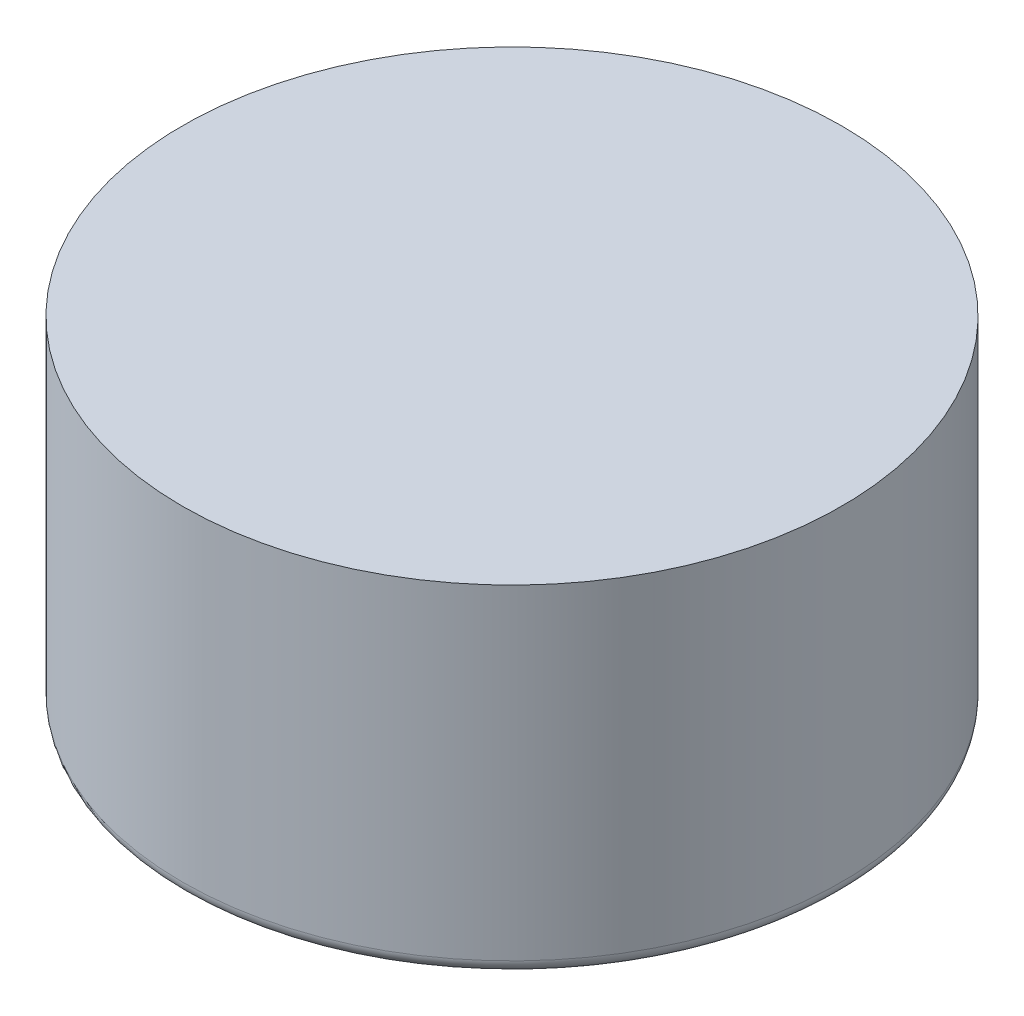
ISO-10303-21;
HEADER;
FILE_DESCRIPTION(('STEP AP214'),'2;1');
FILE_NAME('part.step','',(''),(''),'','','');
FILE_SCHEMA(('AUTOMOTIVE_DESIGN { 1 0 10303 214 1 1 1 1 }'));
ENDSEC;
DATA;
#1=APPLICATION_CONTEXT('core data for automotive mechanical design processes');
#2=APPLICATION_PROTOCOL_DEFINITION('international standard','automotive_design',2000,#1);
#3=PRODUCT_CONTEXT('',#1,'mechanical');
#4=PRODUCT('Part','Part','',(#3));
#5=PRODUCT_RELATED_PRODUCT_CATEGORY('part','',(#4));
#6=PRODUCT_DEFINITION_FORMATION('','',#4);
#7=PRODUCT_DEFINITION_CONTEXT('part definition',#1,'design');
#8=PRODUCT_DEFINITION('design','',#6,#7);
#9=PRODUCT_DEFINITION_SHAPE('','',#8);
#10=(LENGTH_UNIT() NAMED_UNIT(*) SI_UNIT(.MILLI.,.METRE.));
#11=(NAMED_UNIT(*) PLANE_ANGLE_UNIT() SI_UNIT($,.RADIAN.));
#12=(NAMED_UNIT(*) SI_UNIT($,.STERADIAN.) SOLID_ANGLE_UNIT());
#13=UNCERTAINTY_MEASURE_WITH_UNIT(LENGTH_MEASURE(1.E-05),#10,'distance_accuracy_value','');
#14=(GEOMETRIC_REPRESENTATION_CONTEXT(3) GLOBAL_UNCERTAINTY_ASSIGNED_CONTEXT((#13)) GLOBAL_UNIT_ASSIGNED_CONTEXT((#10,
#11,#12)) REPRESENTATION_CONTEXT('',''));
#15=CARTESIAN_POINT('',(0.,0.,0.));
#16=DIRECTION('',(0.,0.,1.));
#17=DIRECTION('',(1.,0.,0.));
#18=AXIS2_PLACEMENT_3D('',#15,#16,#17);
#19=CARTESIAN_POINT('',(0.,40.4,6.97535678855952));
#20=DIRECTION('',(0.,-1.,0.));
#21=DIRECTION('',(0.,0.,-1.));
#22=AXIS2_PLACEMENT_3D('',#19,#20,#21);
#23=CYLINDRICAL_SURFACE('',#22,12.05);
#24=CARTESIAN_POINT('',(0.,28.5,6.97535678855952));
#25=DIRECTION('',(0.,1.,0.));
#26=DIRECTION('',(0.,0.,1.));
#27=AXIS2_PLACEMENT_3D('',#24,#25,#26);
#28=CIRCLE('',#27,12.05);
#29=CARTESIAN_POINT('',(0.,28.5,19.0253567885595));
#30=VERTEX_POINT('',#29);
#31=EDGE_CURVE('E106',#30,#30,#28,.T.);
#32=ORIENTED_EDGE('',*,*,#31,.T.);
#33=EDGE_LOOP('',(#32));
#34=FACE_BOUND('',#33,.T.);
#35=CARTESIAN_POINT('',(0.,40.4,6.97535678855952));
#36=DIRECTION('',(0.,1.,0.));
#37=DIRECTION('',(0.,0.,1.));
#38=AXIS2_PLACEMENT_3D('',#35,#36,#37);
#39=CIRCLE('',#38,12.05);
#40=CARTESIAN_POINT('',(0.,40.4,19.0253567885595));
#41=VERTEX_POINT('',#40);
#42=EDGE_CURVE('E110',#41,#41,#39,.T.);
#43=ORIENTED_EDGE('',*,*,#42,.F.);
#44=EDGE_LOOP('',(#43));
#45=FACE_BOUND('',#44,.T.);
#46=ADVANCED_FACE('F34',(#34,#45),#23,.T.);
#47=CARTESIAN_POINT('',(0.,40.4,6.97535678855952));
#48=DIRECTION('',(0.,1.,0.));
#49=DIRECTION('',(0.,0.,1.));
#50=AXIS2_PLACEMENT_3D('',#47,#48,#49);
#51=PLANE('',#50);
#52=ORIENTED_EDGE('',*,*,#42,.T.);
#53=EDGE_LOOP('',(#52));
#54=FACE_BOUND('',#53,.T.);
#55=ADVANCED_FACE('F171',(#54),#51,.T.);
#56=CARTESIAN_POINT('',(0.,28.,6.97535678855952));
#57=DIRECTION('',(0.,1.,0.));
#58=DIRECTION('',(0.,0.,1.));
#59=AXIS2_PLACEMENT_3D('',#56,#57,#58);
#60=PLANE('',#59);
#61=CARTESIAN_POINT('',(8.5,28.,6.97535678855943));
#62=DIRECTION('',(0.,1.,0.));
#63=DIRECTION('',(0.,0.,1.));
#64=AXIS2_PLACEMENT_3D('',#61,#62,#63);
#65=CIRCLE('',#64,1.2);
#66=CARTESIAN_POINT('',(8.5,28.,8.17535678855943));
#67=VERTEX_POINT('',#66);
#68=EDGE_CURVE('E10',#67,#67,#65,.T.);
#69=ORIENTED_EDGE('',*,*,#68,.T.);
#70=EDGE_LOOP('',(#69));
#71=FACE_BOUND('',#70,.T.);
#72=CARTESIAN_POINT('',(4.25000000000006,28.,14.3365727207272));
#73=DIRECTION('',(0.,1.,0.));
#74=DIRECTION('',(0.,0.,1.));
#75=AXIS2_PLACEMENT_3D('',#72,#73,#74);
#76=CIRCLE('',#75,1.2);
#77=CARTESIAN_POINT('',(4.25000000000006,28.,15.5365727207272));
#78=VERTEX_POINT('',#77);
#79=EDGE_CURVE('E48',#78,#78,#76,.T.);
#80=ORIENTED_EDGE('',*,*,#79,.T.);
#81=EDGE_LOOP('',(#80));
#82=FACE_BOUND('',#81,.T.);
#83=CARTESIAN_POINT('',(-4.25000000000001,28.,14.3365727207272));
#84=DIRECTION('',(0.,1.,0.));
#85=DIRECTION('',(0.,0.,1.));
#86=AXIS2_PLACEMENT_3D('',#83,#84,#85);
#87=CIRCLE('',#86,1.2);
#88=CARTESIAN_POINT('',(-4.25000000000001,28.,15.5365727207272));
#89=VERTEX_POINT('',#88);
#90=EDGE_CURVE('E60',#89,#89,#87,.T.);
#91=ORIENTED_EDGE('',*,*,#90,.T.);
#92=EDGE_LOOP('',(#91));
#93=FACE_BOUND('',#92,.T.);
#94=CARTESIAN_POINT('',(-8.5,28.,6.97535678855954));
#95=DIRECTION('',(0.,1.,0.));
#96=DIRECTION('',(0.,0.,1.));
#97=AXIS2_PLACEMENT_3D('',#94,#95,#96);
#98=CIRCLE('',#97,1.2);
#99=CARTESIAN_POINT('',(-8.5,28.,8.17535678855954));
#100=VERTEX_POINT('',#99);
#101=EDGE_CURVE('E68',#100,#100,#98,.T.);
#102=ORIENTED_EDGE('',*,*,#101,.T.);
#103=EDGE_LOOP('',(#102));
#104=FACE_BOUND('',#103,.T.);
#105=CARTESIAN_POINT('',(-4.25000000000001,28.,-0.385859143608207));
#106=DIRECTION('',(0.,1.,0.));
#107=DIRECTION('',(0.,0.,1.));
#108=AXIS2_PLACEMENT_3D('',#105,#106,#107);
#109=CIRCLE('',#108,1.2);
#110=CARTESIAN_POINT('',(-4.25000000000001,28.,0.814140856391792));
#111=VERTEX_POINT('',#110);
#112=EDGE_CURVE('E76',#111,#111,#109,.T.);
#113=ORIENTED_EDGE('',*,*,#112,.T.);
#114=EDGE_LOOP('',(#113));
#115=FACE_BOUND('',#114,.T.);
#116=CARTESIAN_POINT('',(4.25000000000001,28.,-0.385859143608204));
#117=DIRECTION('',(0.,1.,0.));
#118=DIRECTION('',(0.,0.,1.));
#119=AXIS2_PLACEMENT_3D('',#116,#117,#118);
#120=CIRCLE('',#119,1.2);
#121=CARTESIAN_POINT('',(4.25000000000001,28.,0.814140856391796));
#122=VERTEX_POINT('',#121);
#123=EDGE_CURVE('E84',#122,#122,#120,.T.);
#124=ORIENTED_EDGE('',*,*,#123,.T.);
#125=EDGE_LOOP('',(#124));
#126=FACE_BOUND('',#125,.T.);
#127=CARTESIAN_POINT('',(0.,28.,-1.52464321144048));
#128=DIRECTION('',(0.,-1.,0.));
#129=DIRECTION('',(0.,0.,-1.));
#130=AXIS2_PLACEMENT_3D('',#127,#128,#129);
#131=CIRCLE('',#130,1.);
#132=CARTESIAN_POINT('',(0.,28.,-2.52464321144048));
#133=VERTEX_POINT('',#132);
#134=EDGE_CURVE('E121',#133,#133,#131,.T.);
#135=ORIENTED_EDGE('',*,*,#134,.F.);
#136=EDGE_LOOP('',(#135));
#137=FACE_BOUND('',#136,.T.);
#138=CARTESIAN_POINT('',(0.,28.,6.97535678855952));
#139=DIRECTION('',(0.,1.,0.));
#140=DIRECTION('',(0.,0.,1.));
#141=AXIS2_PLACEMENT_3D('',#138,#139,#140);
#142=CIRCLE('',#141,3.075);
#143=CARTESIAN_POINT('',(0.,28.,10.0503567885595));
#144=VERTEX_POINT('',#143);
#145=EDGE_CURVE('E92',#144,#144,#142,.F.);
#146=ORIENTED_EDGE('',*,*,#145,.F.);
#147=EDGE_LOOP('',(#146));
#148=FACE_BOUND('',#147,.T.);
#149=CARTESIAN_POINT('',(0.,28.,6.97535678855952));
#150=DIRECTION('',(0.,1.,0.));
#151=DIRECTION('',(0.,0.,1.));
#152=AXIS2_PLACEMENT_3D('',#149,#150,#151);
#153=CIRCLE('',#152,11.55);
#154=CARTESIAN_POINT('',(0.,28.,18.5253567885595));
#155=VERTEX_POINT('',#154);
#156=EDGE_CURVE('E96',#155,#155,#153,.F.);
#157=ORIENTED_EDGE('',*,*,#156,.T.);
#158=EDGE_LOOP('',(#157));
#159=FACE_BOUND('',#158,.T.);
#160=ADVANCED_FACE('F177',(#71,#82,#93,#104,#115,#126,#137,#148,#159),#60,.F.);
#161=CARTESIAN_POINT('',(0.,28.5,6.97535678855952));
#162=DIRECTION('',(0.,1.,0.));
#163=DIRECTION('',(0.,0.,1.));
#164=AXIS2_PLACEMENT_3D('',#161,#162,#163);
#165=TOROIDAL_SURFACE('',#164,11.55,0.5);
#166=ORIENTED_EDGE('',*,*,#156,.F.);
#167=EDGE_LOOP('',(#166));
#168=FACE_BOUND('',#167,.T.);
#169=ORIENTED_EDGE('',*,*,#31,.F.);
#170=EDGE_LOOP('',(#169));
#171=FACE_BOUND('',#170,.T.);
#172=ADVANCED_FACE('F183',(#168,#171),#165,.T.);
#173=CARTESIAN_POINT('',(0.,27.,6.97535678855952));
#174=DIRECTION('',(0.,1.,0.));
#175=DIRECTION('',(0.,0.,1.));
#176=AXIS2_PLACEMENT_3D('',#173,#174,#175);
#177=CYLINDRICAL_SURFACE('',#176,3.075);
#178=CARTESIAN_POINT('',(0.,27.,6.97535678855952));
#179=DIRECTION('',(0.,-1.,0.));
#180=DIRECTION('',(0.,0.,-1.));
#181=AXIS2_PLACEMENT_3D('',#178,#179,#180);
#182=CIRCLE('',#181,3.075);
#183=CARTESIAN_POINT('',(0.,27.,3.90035678855952));
#184=VERTEX_POINT('',#183);
#185=EDGE_CURVE('E102',#184,#184,#182,.T.);
#186=ORIENTED_EDGE('',*,*,#185,.F.);
#187=EDGE_LOOP('',(#186));
#188=FACE_BOUND('',#187,.T.);
#189=ORIENTED_EDGE('',*,*,#145,.T.);
#190=EDGE_LOOP('',(#189));
#191=FACE_BOUND('',#190,.T.);
#192=ADVANCED_FACE('F186',(#188,#191),#177,.T.);
#193=CARTESIAN_POINT('',(0.,27.,6.97535678855952));
#194=DIRECTION('',(0.,-1.,0.));
#195=DIRECTION('',(0.,0.,-1.));
#196=AXIS2_PLACEMENT_3D('',#193,#194,#195);
#197=PLANE('',#196);
#198=CARTESIAN_POINT('',(0.,27.,6.97535678855952));
#199=DIRECTION('',(0.,-1.,0.));
#200=DIRECTION('',(0.,0.,-1.));
#201=AXIS2_PLACEMENT_3D('',#198,#199,#200);
#202=CIRCLE('',#201,1.);
#203=CARTESIAN_POINT('',(0.,27.,5.97535678855952));
#204=VERTEX_POINT('',#203);
#205=EDGE_CURVE('E97',#204,#204,#202,.T.);
#206=ORIENTED_EDGE('',*,*,#205,.F.);
#207=EDGE_LOOP('',(#206));
#208=FACE_BOUND('',#207,.T.);
#209=ORIENTED_EDGE('',*,*,#185,.T.);
#210=EDGE_LOOP('',(#209));
#211=FACE_BOUND('',#210,.T.);
#212=ADVANCED_FACE('F255',(#208,#211),#197,.T.);
#213=CARTESIAN_POINT('',(0.,22.7,6.97535678855952));
#214=DIRECTION('',(0.,-1.,0.));
#215=DIRECTION('',(0.,0.,-1.));
#216=AXIS2_PLACEMENT_3D('',#213,#214,#215);
#217=PLANE('',#216);
#218=CARTESIAN_POINT('',(0.,22.7,6.97535678855952));
#219=DIRECTION('',(0.,-1.,0.));
#220=DIRECTION('',(0.,0.,-1.));
#221=AXIS2_PLACEMENT_3D('',#218,#219,#220);
#222=CIRCLE('',#221,1.);
#223=CARTESIAN_POINT('',(0.,22.7,5.97535678855952));
#224=VERTEX_POINT('',#223);
#225=EDGE_CURVE('E101',#224,#224,#222,.T.);
#226=ORIENTED_EDGE('',*,*,#225,.T.);
#227=EDGE_LOOP('',(#226));
#228=FACE_BOUND('',#227,.T.);
#229=ADVANCED_FACE('F258',(#228),#217,.T.);
#230=CARTESIAN_POINT('',(0.,22.7,6.97535678855952));
#231=DIRECTION('',(0.,1.,0.));
#232=DIRECTION('',(0.,0.,1.));
#233=AXIS2_PLACEMENT_3D('',#230,#231,#232);
#234=CYLINDRICAL_SURFACE('',#233,1.);
#235=ORIENTED_EDGE('',*,*,#205,.T.);
#236=EDGE_LOOP('',(#235));
#237=FACE_BOUND('',#236,.T.);
#238=ORIENTED_EDGE('',*,*,#225,.F.);
#239=EDGE_LOOP('',(#238));
#240=FACE_BOUND('',#239,.T.);
#241=ADVANCED_FACE('F253',(#237,#240),#234,.T.);
#242=CARTESIAN_POINT('',(0.,30.,-1.52464321144048));
#243=DIRECTION('',(0.,-1.,0.));
#244=DIRECTION('',(0.,0.,-1.));
#245=AXIS2_PLACEMENT_3D('',#242,#243,#244);
#246=CYLINDRICAL_SURFACE('',#245,1.);
#247=CARTESIAN_POINT('',(0.,30.,-1.52464321144048));
#248=DIRECTION('',(0.,-1.,0.));
#249=DIRECTION('',(0.,0.,-1.));
#250=AXIS2_PLACEMENT_3D('',#247,#248,#249);
#251=CIRCLE('',#250,1.);
#252=CARTESIAN_POINT('',(0.,30.,-2.52464321144048));
#253=VERTEX_POINT('',#252);
#254=EDGE_CURVE('E120',#253,#253,#251,.T.);
#255=ORIENTED_EDGE('',*,*,#254,.F.);
#256=EDGE_LOOP('',(#255));
#257=FACE_BOUND('',#256,.T.);
#258=ORIENTED_EDGE('',*,*,#134,.T.);
#259=EDGE_LOOP('',(#258));
#260=FACE_BOUND('',#259,.T.);
#261=ADVANCED_FACE('F249',(#257,#260),#246,.F.);
#262=CARTESIAN_POINT('',(0.,30.,-1.52464321144048));
#263=DIRECTION('',(0.,-1.,0.));
#264=DIRECTION('',(0.,0.,-1.));
#265=AXIS2_PLACEMENT_3D('',#262,#263,#264);
#266=PLANE('',#265);
#267=ORIENTED_EDGE('',*,*,#254,.T.);
#268=EDGE_LOOP('',(#267));
#269=FACE_BOUND('',#268,.T.);
#270=ADVANCED_FACE('F245',(#269),#266,.T.);
#271=CARTESIAN_POINT('',(4.25000000000001,30.,-0.385859143608204));
#272=DIRECTION('',(0.,-1.,0.));
#273=DIRECTION('',(0.,0.,-1.));
#274=AXIS2_PLACEMENT_3D('',#271,#272,#273);
#275=CYLINDRICAL_SURFACE('',#274,1.);
#276=CARTESIAN_POINT('',(4.25000000000001,28.2,-0.385859143608204));
#277=DIRECTION('',(0.,1.,0.));
#278=DIRECTION('',(0.,0.,1.));
#279=AXIS2_PLACEMENT_3D('',#276,#277,#278);
#280=CIRCLE('',#279,1.);
#281=CARTESIAN_POINT('',(4.25000000000001,28.2,0.614140856391796));
#282=VERTEX_POINT('',#281);
#283=EDGE_CURVE('E88',#282,#282,#280,.F.);
#284=ORIENTED_EDGE('',*,*,#283,.T.);
#285=EDGE_LOOP('',(#284));
#286=FACE_BOUND('',#285,.T.);
#287=CARTESIAN_POINT('',(4.25000000000001,30.,-0.385859143608204));
#288=DIRECTION('',(0.,-1.,0.));
#289=DIRECTION('',(0.,0.,-1.));
#290=AXIS2_PLACEMENT_3D('',#287,#288,#289);
#291=CIRCLE('',#290,1.);
#292=CARTESIAN_POINT('',(4.25000000000001,30.,-1.3858591436082));
#293=VERTEX_POINT('',#292);
#294=EDGE_CURVE('E125',#293,#293,#291,.T.);
#295=ORIENTED_EDGE('',*,*,#294,.F.);
#296=EDGE_LOOP('',(#295));
#297=FACE_BOUND('',#296,.T.);
#298=ADVANCED_FACE('F241',(#286,#297),#275,.F.);
#299=CARTESIAN_POINT('',(4.25000000000001,30.,-0.385859143608204));
#300=DIRECTION('',(0.,-1.,0.));
#301=DIRECTION('',(0.,0.,-1.));
#302=AXIS2_PLACEMENT_3D('',#299,#300,#301);
#303=PLANE('',#302);
#304=ORIENTED_EDGE('',*,*,#294,.T.);
#305=EDGE_LOOP('',(#304));
#306=FACE_BOUND('',#305,.T.);
#307=ADVANCED_FACE('F192',(#306),#303,.T.);
#308=CARTESIAN_POINT('',(4.25000000000001,28.2,-0.385859143608204));
#309=DIRECTION('',(0.,1.,0.));
#310=DIRECTION('',(0.,0.,1.));
#311=AXIS2_PLACEMENT_3D('',#308,#309,#310);
#312=TOROIDAL_SURFACE('',#311,1.2,0.2);
#313=ORIENTED_EDGE('',*,*,#123,.F.);
#314=EDGE_LOOP('',(#313));
#315=FACE_BOUND('',#314,.T.);
#316=ORIENTED_EDGE('',*,*,#283,.F.);
#317=EDGE_LOOP('',(#316));
#318=FACE_BOUND('',#317,.T.);
#319=ADVANCED_FACE('F188',(#315,#318),#312,.T.);
#320=CARTESIAN_POINT('',(8.5,30.,6.97535678855943));
#321=DIRECTION('',(0.,-1.,0.));
#322=DIRECTION('',(0.,0.,-1.));
#323=AXIS2_PLACEMENT_3D('',#320,#321,#322);
#324=CYLINDRICAL_SURFACE('',#323,1.);
#325=CARTESIAN_POINT('',(8.5,28.2,6.97535678855943));
#326=DIRECTION('',(0.,1.,0.));
#327=DIRECTION('',(0.,0.,1.));
#328=AXIS2_PLACEMENT_3D('',#325,#326,#327);
#329=CIRCLE('',#328,1.);
#330=CARTESIAN_POINT('',(8.5,28.2,7.97535678855943));
#331=VERTEX_POINT('',#330);
#332=EDGE_CURVE('E42',#331,#331,#329,.F.);
#333=ORIENTED_EDGE('',*,*,#332,.T.);
#334=EDGE_LOOP('',(#333));
#335=FACE_BOUND('',#334,.T.);
#336=CARTESIAN_POINT('',(8.5,30.,6.97535678855943));
#337=DIRECTION('',(0.,-1.,0.));
#338=DIRECTION('',(0.866025403784433,0.,-0.50000000000001));
#339=AXIS2_PLACEMENT_3D('',#336,#337,#338);
#340=CIRCLE('',#339,1.);
#341=CARTESIAN_POINT('',(9.36602540378443,30.,6.47535678855942));
#342=VERTEX_POINT('',#341);
#343=EDGE_CURVE('E133',#342,#342,#340,.T.);
#344=ORIENTED_EDGE('',*,*,#343,.F.);
#345=EDGE_LOOP('',(#344));
#346=FACE_BOUND('',#345,.T.);
#347=ADVANCED_FACE('F191',(#335,#346),#324,.F.);
#348=CARTESIAN_POINT('',(8.5,30.,6.97535678855943));
#349=DIRECTION('',(0.,-1.,0.));
#350=DIRECTION('',(0.866025403784433,0.,-0.50000000000001));
#351=AXIS2_PLACEMENT_3D('',#348,#349,#350);
#352=PLANE('',#351);
#353=ORIENTED_EDGE('',*,*,#343,.T.);
#354=EDGE_LOOP('',(#353));
#355=FACE_BOUND('',#354,.T.);
#356=ADVANCED_FACE('F219',(#355),#352,.T.);
#357=CARTESIAN_POINT('',(4.25000000000006,30.,14.3365727207272));
#358=DIRECTION('',(0.,-1.,0.));
#359=DIRECTION('',(0.,0.,-1.));
#360=AXIS2_PLACEMENT_3D('',#357,#358,#359);
#361=CYLINDRICAL_SURFACE('',#360,1.);
#362=CARTESIAN_POINT('',(4.25000000000006,28.2,14.3365727207272));
#363=DIRECTION('',(0.,1.,0.));
#364=DIRECTION('',(0.,0.,1.));
#365=AXIS2_PLACEMENT_3D('',#362,#363,#364);
#366=CIRCLE('',#365,1.);
#367=CARTESIAN_POINT('',(4.25000000000006,28.2,15.3365727207272));
#368=VERTEX_POINT('',#367);
#369=EDGE_CURVE('E54',#368,#368,#366,.F.);
#370=ORIENTED_EDGE('',*,*,#369,.T.);
#371=EDGE_LOOP('',(#370));
#372=FACE_BOUND('',#371,.T.);
#373=CARTESIAN_POINT('',(4.25000000000006,30.,14.3365727207272));
#374=DIRECTION('',(0.,-1.,0.));
#375=DIRECTION('',(0.866025403784443,0.,0.499999999999992));
#376=AXIS2_PLACEMENT_3D('',#373,#374,#375);
#377=CIRCLE('',#376,1.);
#378=CARTESIAN_POINT('',(5.1160254037845,30.,14.8365727207272));
#379=VERTEX_POINT('',#378);
#380=EDGE_CURVE('E137',#379,#379,#377,.T.);
#381=ORIENTED_EDGE('',*,*,#380,.F.);
#382=EDGE_LOOP('',(#381));
#383=FACE_BOUND('',#382,.T.);
#384=ADVANCED_FACE('F215',(#372,#383),#361,.F.);
#385=CARTESIAN_POINT('',(4.25000000000006,30.,14.3365727207272));
#386=DIRECTION('',(0.,-1.,0.));
#387=DIRECTION('',(0.866025403784443,0.,0.499999999999992));
#388=AXIS2_PLACEMENT_3D('',#385,#386,#387);
#389=PLANE('',#388);
#390=ORIENTED_EDGE('',*,*,#380,.T.);
#391=EDGE_LOOP('',(#390));
#392=FACE_BOUND('',#391,.T.);
#393=ADVANCED_FACE('F218',(#392),#389,.T.);
#394=CARTESIAN_POINT('',(-4.25000000000001,30.,14.3365727207272));
#395=DIRECTION('',(0.,-1.,0.));
#396=DIRECTION('',(0.,0.,-1.));
#397=AXIS2_PLACEMENT_3D('',#394,#395,#396);
#398=CYLINDRICAL_SURFACE('',#397,1.);
#399=CARTESIAN_POINT('',(-4.25000000000001,28.2,14.3365727207272));
#400=DIRECTION('',(0.,1.,0.));
#401=DIRECTION('',(0.,0.,1.));
#402=AXIS2_PLACEMENT_3D('',#399,#400,#401);
#403=CIRCLE('',#402,1.);
#404=CARTESIAN_POINT('',(-4.25000000000001,28.2,15.3365727207272));
#405=VERTEX_POINT('',#404);
#406=EDGE_CURVE('E64',#405,#405,#403,.F.);
#407=ORIENTED_EDGE('',*,*,#406,.T.);
#408=EDGE_LOOP('',(#407));
#409=FACE_BOUND('',#408,.T.);
#410=CARTESIAN_POINT('',(-4.25000000000001,30.,14.3365727207272));
#411=DIRECTION('',(0.,-1.,0.));
#412=DIRECTION('',(0.,0.,1.));
#413=AXIS2_PLACEMENT_3D('',#410,#411,#412);
#414=CIRCLE('',#413,1.);
#415=CARTESIAN_POINT('',(-4.25000000000001,30.,15.3365727207272));
#416=VERTEX_POINT('',#415);
#417=EDGE_CURVE('E141',#416,#416,#414,.T.);
#418=ORIENTED_EDGE('',*,*,#417,.F.);
#419=EDGE_LOOP('',(#418));
#420=FACE_BOUND('',#419,.T.);
#421=ADVANCED_FACE('F224',(#409,#420),#398,.F.);
#422=CARTESIAN_POINT('',(-4.25000000000001,30.,14.3365727207272));
#423=DIRECTION('',(0.,-1.,0.));
#424=DIRECTION('',(0.,0.,1.));
#425=AXIS2_PLACEMENT_3D('',#422,#423,#424);
#426=PLANE('',#425);
#427=ORIENTED_EDGE('',*,*,#417,.T.);
#428=EDGE_LOOP('',(#427));
#429=FACE_BOUND('',#428,.T.);
#430=ADVANCED_FACE('F229',(#429),#426,.T.);
#431=CARTESIAN_POINT('',(-8.5,30.,6.97535678855954));
#432=DIRECTION('',(0.,-1.,0.));
#433=DIRECTION('',(0.,0.,-1.));
#434=AXIS2_PLACEMENT_3D('',#431,#432,#433);
#435=CYLINDRICAL_SURFACE('',#434,1.);
#436=CARTESIAN_POINT('',(-8.5,28.2,6.97535678855954));
#437=DIRECTION('',(0.,1.,0.));
#438=DIRECTION('',(0.,0.,1.));
#439=AXIS2_PLACEMENT_3D('',#436,#437,#438);
#440=CIRCLE('',#439,1.);
#441=CARTESIAN_POINT('',(-8.5,28.2,7.97535678855954));
#442=VERTEX_POINT('',#441);
#443=EDGE_CURVE('E72',#442,#442,#440,.F.);
#444=ORIENTED_EDGE('',*,*,#443,.T.);
#445=EDGE_LOOP('',(#444));
#446=FACE_BOUND('',#445,.T.);
#447=CARTESIAN_POINT('',(-8.5,30.,6.97535678855954));
#448=DIRECTION('',(0.,-1.,0.));
#449=DIRECTION('',(-0.866025403784436,0.,0.500000000000004));
#450=AXIS2_PLACEMENT_3D('',#447,#448,#449);
#451=CIRCLE('',#450,1.);
#452=CARTESIAN_POINT('',(-9.36602540378444,30.,7.47535678855955));
#453=VERTEX_POINT('',#452);
#454=EDGE_CURVE('E145',#453,#453,#451,.T.);
#455=ORIENTED_EDGE('',*,*,#454,.F.);
#456=EDGE_LOOP('',(#455));
#457=FACE_BOUND('',#456,.T.);
#458=ADVANCED_FACE('F167',(#446,#457),#435,.F.);
#459=CARTESIAN_POINT('',(-8.5,30.,6.97535678855954));
#460=DIRECTION('',(0.,-1.,0.));
#461=DIRECTION('',(-0.866025403784436,0.,0.500000000000004));
#462=AXIS2_PLACEMENT_3D('',#459,#460,#461);
#463=PLANE('',#462);
#464=ORIENTED_EDGE('',*,*,#454,.T.);
#465=EDGE_LOOP('',(#464));
#466=FACE_BOUND('',#465,.T.);
#467=ADVANCED_FACE('F158',(#466),#463,.T.);
#468=CARTESIAN_POINT('',(-4.25000000000001,30.,-0.385859143608207));
#469=DIRECTION('',(0.,-1.,0.));
#470=DIRECTION('',(0.,0.,-1.));
#471=AXIS2_PLACEMENT_3D('',#468,#469,#470);
#472=CYLINDRICAL_SURFACE('',#471,1.);
#473=CARTESIAN_POINT('',(-4.25000000000001,28.2,-0.385859143608207));
#474=DIRECTION('',(0.,1.,0.));
#475=DIRECTION('',(0.,0.,1.));
#476=AXIS2_PLACEMENT_3D('',#473,#474,#475);
#477=CIRCLE('',#476,1.);
#478=CARTESIAN_POINT('',(-4.25000000000001,28.2,0.614140856391792));
#479=VERTEX_POINT('',#478);
#480=EDGE_CURVE('E80',#479,#479,#477,.F.);
#481=ORIENTED_EDGE('',*,*,#480,.T.);
#482=EDGE_LOOP('',(#481));
#483=FACE_BOUND('',#482,.T.);
#484=CARTESIAN_POINT('',(-4.25000000000001,30.,-0.385859143608207));
#485=DIRECTION('',(0.,-1.,0.));
#486=DIRECTION('',(-0.86602540378444,0.,-0.499999999999998));
#487=AXIS2_PLACEMENT_3D('',#484,#485,#486);
#488=CIRCLE('',#487,1.);
#489=CARTESIAN_POINT('',(-5.11602540378445,30.,-0.885859143608205));
#490=VERTEX_POINT('',#489);
#491=EDGE_CURVE('E132',#490,#490,#488,.T.);
#492=ORIENTED_EDGE('',*,*,#491,.F.);
#493=EDGE_LOOP('',(#492));
#494=FACE_BOUND('',#493,.T.);
#495=ADVANCED_FACE('F156',(#483,#494),#472,.F.);
#496=CARTESIAN_POINT('',(-4.25000000000001,30.,-0.385859143608207));
#497=DIRECTION('',(0.,-1.,0.));
#498=DIRECTION('',(-0.86602540378444,0.,-0.499999999999998));
#499=AXIS2_PLACEMENT_3D('',#496,#497,#498);
#500=PLANE('',#499);
#501=ORIENTED_EDGE('',*,*,#491,.T.);
#502=EDGE_LOOP('',(#501));
#503=FACE_BOUND('',#502,.T.);
#504=ADVANCED_FACE('F154',(#503),#500,.T.);
#505=CARTESIAN_POINT('',(-4.25000000000001,28.2,-0.385859143608207));
#506=DIRECTION('',(0.,1.,0.));
#507=DIRECTION('',(0.,0.,1.));
#508=AXIS2_PLACEMENT_3D('',#505,#506,#507);
#509=TOROIDAL_SURFACE('',#508,1.2,0.2);
#510=ORIENTED_EDGE('',*,*,#112,.F.);
#511=EDGE_LOOP('',(#510));
#512=FACE_BOUND('',#511,.T.);
#513=ORIENTED_EDGE('',*,*,#480,.F.);
#514=EDGE_LOOP('',(#513));
#515=FACE_BOUND('',#514,.T.);
#516=ADVANCED_FACE('F165',(#512,#515),#509,.T.);
#517=CARTESIAN_POINT('',(-8.5,28.2,6.97535678855954));
#518=DIRECTION('',(0.,1.,0.));
#519=DIRECTION('',(0.,0.,1.));
#520=AXIS2_PLACEMENT_3D('',#517,#518,#519);
#521=TOROIDAL_SURFACE('',#520,1.2,0.2);
#522=ORIENTED_EDGE('',*,*,#101,.F.);
#523=EDGE_LOOP('',(#522));
#524=FACE_BOUND('',#523,.T.);
#525=ORIENTED_EDGE('',*,*,#443,.F.);
#526=EDGE_LOOP('',(#525));
#527=FACE_BOUND('',#526,.T.);
#528=ADVANCED_FACE('F196',(#524,#527),#521,.T.);
#529=CARTESIAN_POINT('',(-4.25000000000001,28.2,14.3365727207272));
#530=DIRECTION('',(0.,1.,0.));
#531=DIRECTION('',(0.,0.,1.));
#532=AXIS2_PLACEMENT_3D('',#529,#530,#531);
#533=TOROIDAL_SURFACE('',#532,1.2,0.2);
#534=ORIENTED_EDGE('',*,*,#90,.F.);
#535=EDGE_LOOP('',(#534));
#536=FACE_BOUND('',#535,.T.);
#537=ORIENTED_EDGE('',*,*,#406,.F.);
#538=EDGE_LOOP('',(#537));
#539=FACE_BOUND('',#538,.T.);
#540=ADVANCED_FACE('F200',(#536,#539),#533,.T.);
#541=CARTESIAN_POINT('',(4.25000000000006,28.2,14.3365727207272));
#542=DIRECTION('',(0.,1.,0.));
#543=DIRECTION('',(0.,0.,1.));
#544=AXIS2_PLACEMENT_3D('',#541,#542,#543);
#545=TOROIDAL_SURFACE('',#544,1.2,0.2);
#546=ORIENTED_EDGE('',*,*,#79,.F.);
#547=EDGE_LOOP('',(#546));
#548=FACE_BOUND('',#547,.T.);
#549=ORIENTED_EDGE('',*,*,#369,.F.);
#550=EDGE_LOOP('',(#549));
#551=FACE_BOUND('',#550,.T.);
#552=ADVANCED_FACE('F203',(#548,#551),#545,.T.);
#553=CARTESIAN_POINT('',(8.5,28.2,6.97535678855943));
#554=DIRECTION('',(0.,1.,0.));
#555=DIRECTION('',(0.,0.,1.));
#556=AXIS2_PLACEMENT_3D('',#553,#554,#555);
#557=TOROIDAL_SURFACE('',#556,1.2,0.2);
#558=ORIENTED_EDGE('',*,*,#68,.F.);
#559=EDGE_LOOP('',(#558));
#560=FACE_BOUND('',#559,.T.);
#561=ORIENTED_EDGE('',*,*,#332,.F.);
#562=EDGE_LOOP('',(#561));
#563=FACE_BOUND('',#562,.T.);
#564=ADVANCED_FACE('F36',(#560,#563),#557,.T.);
#565=CLOSED_SHELL('',(#46,#55,#160,#172,#192,#212,#229,#241,#261,#270,#298,#307,#319,#347,#356,
#384,#393,#421,#430,#458,#467,#495,#504,#516,#528,#540,#552,#564));
#566=MANIFOLD_SOLID_BREP('B2',#565);
#567=ADVANCED_BREP_SHAPE_REPRESENTATION('',(#18,#566),#14);
#568=SHAPE_DEFINITION_REPRESENTATION(#9,#567);
ENDSEC;
END-ISO-10303-21;
